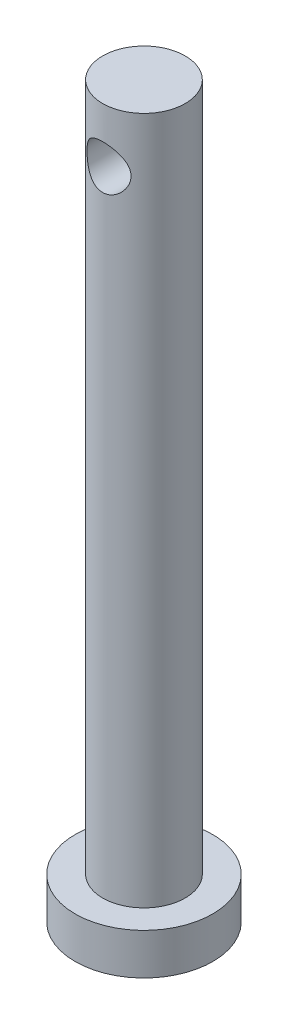
ISO-10303-21;
HEADER;
FILE_DESCRIPTION(('STEP AP214'),'2;1');
FILE_NAME('part.step','',(''),(''),'','','');
FILE_SCHEMA(('AUTOMOTIVE_DESIGN { 1 0 10303 214 1 1 1 1 }'));
ENDSEC;
DATA;
#1=APPLICATION_CONTEXT('core data for automotive mechanical design processes');
#2=APPLICATION_PROTOCOL_DEFINITION('international standard','automotive_design',2000,#1);
#3=PRODUCT_CONTEXT('',#1,'mechanical');
#4=PRODUCT('Part','Part','',(#3));
#5=PRODUCT_RELATED_PRODUCT_CATEGORY('part','',(#4));
#6=PRODUCT_DEFINITION_FORMATION('','',#4);
#7=PRODUCT_DEFINITION_CONTEXT('part definition',#1,'design');
#8=PRODUCT_DEFINITION('design','',#6,#7);
#9=PRODUCT_DEFINITION_SHAPE('','',#8);
#10=(LENGTH_UNIT() NAMED_UNIT(*) SI_UNIT(.MILLI.,.METRE.));
#11=(NAMED_UNIT(*) PLANE_ANGLE_UNIT() SI_UNIT($,.RADIAN.));
#12=(NAMED_UNIT(*) SI_UNIT($,.STERADIAN.) SOLID_ANGLE_UNIT());
#13=UNCERTAINTY_MEASURE_WITH_UNIT(LENGTH_MEASURE(1.E-05),#10,'distance_accuracy_value','');
#14=(GEOMETRIC_REPRESENTATION_CONTEXT(3) GLOBAL_UNCERTAINTY_ASSIGNED_CONTEXT((#13)) GLOBAL_UNIT_ASSIGNED_CONTEXT((#10,
#11,#12)) REPRESENTATION_CONTEXT('',''));
#15=CARTESIAN_POINT('',(0.,0.,0.));
#16=DIRECTION('',(0.,0.,1.));
#17=DIRECTION('',(1.,0.,0.));
#18=AXIS2_PLACEMENT_3D('',#15,#16,#17);
#19=CARTESIAN_POINT('',(0.,1.5,0.));
#20=DIRECTION('',(0.,-1.,0.));
#21=DIRECTION('',(0.,0.,-1.));
#22=AXIS2_PLACEMENT_3D('',#19,#20,#21);
#23=CYLINDRICAL_SURFACE('',#22,2.5);
#24=CARTESIAN_POINT('',(0.,1.5,0.));
#25=DIRECTION('',(0.,1.,0.));
#26=DIRECTION('',(0.,0.,1.));
#27=AXIS2_PLACEMENT_3D('',#24,#25,#26);
#28=CIRCLE('',#27,2.5);
#29=CARTESIAN_POINT('',(0.,1.5,2.5));
#30=VERTEX_POINT('',#29);
#31=EDGE_CURVE('E50',#30,#30,#28,.T.);
#32=ORIENTED_EDGE('',*,*,#31,.F.);
#33=EDGE_LOOP('',(#32));
#34=FACE_BOUND('',#33,.T.);
#35=CARTESIAN_POINT('',(0.,0.,0.));
#36=DIRECTION('',(0.,1.,0.));
#37=DIRECTION('',(0.,0.,1.));
#38=AXIS2_PLACEMENT_3D('',#35,#36,#37);
#39=CIRCLE('',#38,2.5);
#40=CARTESIAN_POINT('',(0.,0.,2.5));
#41=VERTEX_POINT('',#40);
#42=EDGE_CURVE('E56',#41,#41,#39,.T.);
#43=ORIENTED_EDGE('',*,*,#42,.T.);
#44=EDGE_LOOP('',(#43));
#45=FACE_BOUND('',#44,.T.);
#46=ADVANCED_FACE('F37',(#34,#45),#23,.T.);
#47=CARTESIAN_POINT('',(0.,1.5,0.));
#48=DIRECTION('',(0.,1.,0.));
#49=DIRECTION('',(0.,0.,1.));
#50=AXIS2_PLACEMENT_3D('',#47,#48,#49);
#51=PLANE('',#50);
#52=CARTESIAN_POINT('',(0.,1.5,0.));
#53=DIRECTION('',(0.,1.,0.));
#54=DIRECTION('',(0.,0.,1.));
#55=AXIS2_PLACEMENT_3D('',#52,#53,#54);
#56=CIRCLE('',#55,1.5);
#57=CARTESIAN_POINT('',(0.,1.5,1.5));
#58=VERTEX_POINT('',#57);
#59=EDGE_CURVE('E10',#58,#58,#56,.T.);
#60=ORIENTED_EDGE('',*,*,#59,.F.);
#61=EDGE_LOOP('',(#60));
#62=FACE_BOUND('',#61,.T.);
#63=ORIENTED_EDGE('',*,*,#31,.T.);
#64=EDGE_LOOP('',(#63));
#65=FACE_BOUND('',#64,.T.);
#66=ADVANCED_FACE('F88',(#62,#65),#51,.T.);
#67=CARTESIAN_POINT('',(0.,0.,0.));
#68=DIRECTION('',(0.,1.,0.));
#69=DIRECTION('',(0.,0.,1.));
#70=AXIS2_PLACEMENT_3D('',#67,#68,#69);
#71=PLANE('',#70);
#72=ORIENTED_EDGE('',*,*,#42,.F.);
#73=EDGE_LOOP('',(#72));
#74=FACE_BOUND('',#73,.T.);
#75=ADVANCED_FACE('F84',(#74),#71,.F.);
#76=CARTESIAN_POINT('',(0.,26.5,0.));
#77=DIRECTION('',(0.,-1.,0.));
#78=DIRECTION('',(0.,0.,-1.));
#79=AXIS2_PLACEMENT_3D('',#76,#77,#78);
#80=CYLINDRICAL_SURFACE('',#79,1.5);
#81=CARTESIAN_POINT('',(0.,25.3,-1.5));
#82=CARTESIAN_POINT('',(-0.0417140042937088,25.2999972917102,-1.49999758414449));
#83=CARTESIAN_POINT('',(-0.0834672912539164,25.2967184035876,-1.49824189360224));
#84=CARTESIAN_POINT('',(-0.165718197334508,25.283758299134,-1.49139129667971));
#85=CARTESIAN_POINT('',(-0.206213769841148,25.2740671669965,-1.48629121869364));
#86=CARTESIAN_POINT('',(-0.284638594945811,25.2487801601417,-1.47328036800654));
#87=CARTESIAN_POINT('',(-0.322577512237572,25.2332081858101,-1.46538097991501));
#88=CARTESIAN_POINT('',(-0.395235474229212,25.196737448288,-1.4474774987237));
#89=CARTESIAN_POINT('',(-0.429954504316263,25.1758386609244,-1.43747339607276));
#90=CARTESIAN_POINT('',(-0.497767319459639,25.1277484382682,-1.41547900666031));
#91=CARTESIAN_POINT('',(-0.530602027463185,25.1002323964802,-1.4034011481073));
#92=CARTESIAN_POINT('',(-0.591434030661653,25.0403968543132,-1.37887042167267));
#93=CARTESIAN_POINT('',(-0.619427089896366,25.0080731932663,-1.36641723648963));
#94=CARTESIAN_POINT('',(-0.672354419511099,24.9360219415222,-1.34122140682262));
#95=CARTESIAN_POINT('',(-0.696776837026744,24.895887951337,-1.32855595701366));
#96=CARTESIAN_POINT('',(-0.738426416316995,24.8113543186488,-1.30586838669548));
#97=CARTESIAN_POINT('',(-0.75565913819353,24.7669580051932,-1.29584422578236));
#98=CARTESIAN_POINT('',(-0.781243551670881,24.6779457306387,-1.28057394848523));
#99=CARTESIAN_POINT('',(-0.79008311742479,24.6335170279096,-1.27506829565278));
#100=CARTESIAN_POINT('',(-0.800094972405448,24.5434961280342,-1.26881331156942));
#101=CARTESIAN_POINT('',(-0.801276946959553,24.4979054738658,-1.26805797215382));
#102=CARTESIAN_POINT('',(-0.796296021649252,24.4137781343534,-1.27118648805135));
#103=CARTESIAN_POINT('',(-0.791143222976705,24.3751515533778,-1.27443251356391));
#104=CARTESIAN_POINT('',(-0.775413455073683,24.299425376058,-1.28406317281932));
#105=CARTESIAN_POINT('',(-0.764834303757536,24.2623264004943,-1.29044906914779));
#106=CARTESIAN_POINT('',(-0.738390252390663,24.1896619734264,-1.30576277857079));
#107=CARTESIAN_POINT('',(-0.722411944930874,24.154149696915,-1.31474447400447));
#108=CARTESIAN_POINT('',(-0.685716522966987,24.0861304736426,-1.3342504708289));
#109=CARTESIAN_POINT('',(-0.66499730854369,24.053624867631,-1.34477545505385));
#110=CARTESIAN_POINT('',(-0.615868522436842,23.9875141387867,-1.36804524940245));
#111=CARTESIAN_POINT('',(-0.58677629115989,23.9544492647533,-1.38088899493241));
#112=CARTESIAN_POINT('',(-0.523451373374351,23.8934246423101,-1.40611558623123));
#113=CARTESIAN_POINT('',(-0.489215573049462,23.8654680092069,-1.41849814710228));
#114=CARTESIAN_POINT('',(-0.414022077031181,23.8138622850858,-1.44230010999534));
#115=CARTESIAN_POINT('',(-0.372785484410792,23.7905688918061,-1.45361823088172));
#116=CARTESIAN_POINT('',(-0.286226859736146,23.7514521168231,-1.47310395304255));
#117=CARTESIAN_POINT('',(-0.240908517249559,23.7356220679969,-1.48127436501701));
#118=CARTESIAN_POINT('',(-0.151832213955906,23.7133223875927,-1.4929099561423));
#119=CARTESIAN_POINT('',(-0.108300131382032,23.70613929869,-1.49673204992477));
#120=CARTESIAN_POINT('',(-0.0204895975412045,23.6990524967996,-1.50050221027202));
#121=CARTESIAN_POINT('',(0.0237884072843994,23.6991445741977,-1.50045251716091));
#122=CARTESIAN_POINT('',(0.107545959760606,23.7062499288307,-1.49667382258832));
#123=CARTESIAN_POINT('',(0.14709644926773,23.7126346407483,-1.49327897244287));
#124=CARTESIAN_POINT('',(0.224469554831581,23.7311074420979,-1.48362188327846));
#125=CARTESIAN_POINT('',(0.262291990687246,23.7431961248567,-1.47735934596487));
#126=CARTESIAN_POINT('',(0.336250167522202,23.7729749424682,-1.46232570811689));
#127=CARTESIAN_POINT('',(0.372320333376869,23.7907972349183,-1.4534959496239));
#128=CARTESIAN_POINT('',(0.441062157410961,23.8313751543016,-1.43413438081761));
#129=CARTESIAN_POINT('',(0.473732482002724,23.8541327063769,-1.42360190671964));
#130=CARTESIAN_POINT('',(0.538489644606411,23.9067448011077,-1.40047645695353));
#131=CARTESIAN_POINT('',(0.570134865108252,23.9370996673289,-1.38778372966929));
#132=CARTESIAN_POINT('',(0.628109862741503,24.0026128359152,-1.36252708549313));
#133=CARTESIAN_POINT('',(0.654434715474712,24.037775538292,-1.34996329805962));
#134=CARTESIAN_POINT('',(0.70274076630891,24.114826486175,-1.32549514327965));
#135=CARTESIAN_POINT('',(0.724310244689174,24.1570081387794,-1.31369210729127));
#136=CARTESIAN_POINT('',(0.759824848176571,24.2452100900862,-1.29347935062968));
#137=CARTESIAN_POINT('',(0.77378083036948,24.2912248141217,-1.28506480237658));
#138=CARTESIAN_POINT('',(0.792295451806951,24.3810138470975,-1.27372513461019));
#139=CARTESIAN_POINT('',(0.797640611545243,24.4245661837155,-1.27034308682665));
#140=CARTESIAN_POINT('',(0.801103834511683,24.5120603141804,-1.26816359887642));
#141=CARTESIAN_POINT('',(0.799226824740038,24.5560018221226,-1.26936303319563));
#142=CARTESIAN_POINT('',(0.789056350744178,24.6373463548581,-1.27570247677833));
#143=CARTESIAN_POINT('',(0.781570591370403,24.6748948907275,-1.28034575552508));
#144=CARTESIAN_POINT('',(0.761493436479322,24.7481339575411,-1.29238691721072));
#145=CARTESIAN_POINT('',(0.748900147495982,24.7838237938842,-1.29978582163339));
#146=CARTESIAN_POINT('',(0.718080352112418,24.8549047795466,-1.3170766557443));
#147=CARTESIAN_POINT('',(0.699543207429632,24.8901285674158,-1.32709848411839));
#148=CARTESIAN_POINT('',(0.657671226676285,24.9572019357598,-1.34833960706443));
#149=CARTESIAN_POINT('',(0.634333807313365,24.9890496853594,-1.35955954483521));
#150=CARTESIAN_POINT('',(0.579583602633468,25.0532730938803,-1.38387269806828));
#151=CARTESIAN_POINT('',(0.54749101835218,25.0850587404488,-1.39700212075101));
#152=CARTESIAN_POINT('',(0.478150164559821,25.1429722703881,-1.42222830059072));
#153=CARTESIAN_POINT('',(0.440898582826826,25.1690964911038,-1.43432438618419));
#154=CARTESIAN_POINT('',(0.3610220026222,25.2154339599367,-1.45651015109521));
#155=CARTESIAN_POINT('',(0.318288665753909,25.2354886264249,-1.4665441059256));
#156=CARTESIAN_POINT('',(0.229399331630398,25.2678536227339,-1.48303856571174));
#157=CARTESIAN_POINT('',(0.183252846928634,25.2801846321223,-1.48950860714735));
#158=CARTESIAN_POINT('',(0.113807677907483,25.2921926712721,-1.49584776109147));
#159=CARTESIAN_POINT('',(0.0911777471195392,25.2951148842016,-1.49739944315896));
#160=CARTESIAN_POINT('',(0.0457024774465213,25.2990193021585,-1.49947623062919));
#161=CARTESIAN_POINT('',(0.0228571359907306,25.300001484004,-1.50000132376498));
#162=CARTESIAN_POINT('',(0.,25.3,-1.5));
#163=B_SPLINE_CURVE_WITH_KNOTS('',3,(#81,#82,#83,#84,#85,#86,#87,#88,#89,#90,#91,#92,#93,#94,
#95,#96,#97,#98,#99,#100,#101,#102,#103,#104,#105,#106,#107,#108,#109,#110,#111,#112,#113,#114,
#115,#116,#117,#118,#119,#120,#121,#122,#123,#124,#125,#126,#127,#128,#129,#130,#131,#132,#133,
#134,#135,#136,#137,#138,#139,#140,#141,#142,#143,#144,#145,#146,#147,#148,#149,#150,#151,#152,
#153,#154,#155,#156,#157,#158,#159,#160,#161,#162),.UNSPECIFIED.,.T.,.F.,(4,2,2,2,2,2,2,2,2,2,2,
2,2,2,2,2,2,2,2,2,2,2,2,2,2,2,2,2,2,2,2,2,2,2,2,2,2,2,2,2,4),(0.,0.125049785968991,
0.250293400579707,0.375033395431379,0.49977395636337,0.632758937517728,0.765859685119312,
0.911100210896853,1.0562282067719,1.19228300426694,1.32816568589671,1.44492819552126,
1.56173769541659,1.68117137196064,1.80065805275817,1.93770170276478,2.07482865313357,
2.22012229846781,2.36528590361979,2.49740165319181,2.62944095746674,2.74950324975935,
2.86957803367866,2.99264692026345,3.11576390008819,3.2521377258514,3.38863720347795,
3.53432584534743,3.67980618389778,3.81103787448892,3.94218005404204,4.05738088818269,
4.17262446873053,4.29529226385601,4.41802624681407,4.55851375899381,4.69909188991154,
4.84307664846753,4.98667423094966,5.05519428454421,5.12371515689633),.UNSPECIFIED.);
#164=CARTESIAN_POINT('',(0.,25.3,-1.5));
#165=VERTEX_POINT('',#164);
#166=EDGE_CURVE('E40',#165,#165,#163,.T.);
#167=ORIENTED_EDGE('',*,*,#166,.T.);
#168=EDGE_LOOP('',(#167));
#169=FACE_BOUND('',#168,.T.);
#170=CARTESIAN_POINT('',(0.799999999999999,24.5,1.26885775404495));
#171=CARTESIAN_POINT('',(0.799996864513051,24.458762734481,1.26886196661874));
#172=CARTESIAN_POINT('',(0.796789664925113,24.4174837174134,1.27089944626369));
#173=CARTESIAN_POINT('',(0.784141291009917,24.3362291826284,1.27873921411509));
#174=CARTESIAN_POINT('',(0.774688773493129,24.2962561758769,1.28454835234238));
#175=CARTESIAN_POINT('',(0.750097396273409,24.2189478007503,1.29905904209522));
#176=CARTESIAN_POINT('',(0.73499213411089,24.181598366817,1.30774346962923));
#177=CARTESIAN_POINT('',(0.699627256753739,24.1099757695486,1.32699887256592));
#178=CARTESIAN_POINT('',(0.679366805899382,24.0757031061798,1.3375701537459));
#179=CARTESIAN_POINT('',(0.632023751834454,24.0076351290107,1.36062558490874));
#180=CARTESIAN_POINT('',(0.604477080012548,23.974191700367,1.37319608798891));
#181=CARTESIAN_POINT('',(0.544304228810776,23.9121200552841,1.39813960186555));
#182=CARTESIAN_POINT('',(0.511675214724456,23.8834945447182,1.41051249817365));
#183=CARTESIAN_POINT('',(0.439108047858338,23.8296399614189,1.43483798338867));
#184=CARTESIAN_POINT('',(0.39879540786664,23.804860459726,1.44667936834789));
#185=CARTESIAN_POINT('',(0.313822774935419,23.7625979764783,1.4674543508573));
#186=CARTESIAN_POINT('',(0.269165926407689,23.7451097651204,1.47639003155785));
#187=CARTESIAN_POINT('',(0.180514514600768,23.7193766465765,1.48971871408987));
#188=CARTESIAN_POINT('',(0.136747205617521,23.7105097801994,1.49441524613384));
#189=CARTESIAN_POINT('',(0.0481154730549656,23.7002055395077,1.49988363624653));
#190=CARTESIAN_POINT('',(0.00325184397866042,23.6987629363926,1.50065825645443));
#191=CARTESIAN_POINT('',(-0.08154999995219,23.7031481461081,1.49832286926248));
#192=CARTESIAN_POINT('',(-0.121537611195848,23.7082729658366,1.49558843812923));
#193=CARTESIAN_POINT('',(-0.199984967913362,23.7243651642756,1.48713233848782));
#194=CARTESIAN_POINT('',(-0.238444597045448,23.7353329869644,1.48141044297904));
#195=CARTESIAN_POINT('',(-0.313348321881749,23.7628265320405,1.46740708636072));
#196=CARTESIAN_POINT('',(-0.349762714854435,23.779417330473,1.45909575243493));
#197=CARTESIAN_POINT('',(-0.419368306071066,23.8175725221139,1.44063483401394));
#198=CARTESIAN_POINT('',(-0.452558417442181,23.8391385842232,1.43048463293558));
#199=CARTESIAN_POINT('',(-0.518447006228243,23.8891833549813,1.40802908686016));
#200=CARTESIAN_POINT('',(-0.550738571603075,23.9181466633751,1.39560941242777));
#201=CARTESIAN_POINT('',(-0.610240413321964,23.9808865794078,1.37063855232127));
#202=CARTESIAN_POINT('',(-0.637445856922971,24.0146677116816,1.35808725341625));
#203=CARTESIAN_POINT('',(-0.688142739262383,24.089326392009,1.33316143624031));
#204=CARTESIAN_POINT('',(-0.711168968556944,24.1305541684691,1.32087975949967));
#205=CARTESIAN_POINT('',(-0.749795437753226,24.2170785911098,1.29934599305322));
#206=CARTESIAN_POINT('',(-0.765404099589988,24.262370552972,1.2900904711841));
#207=CARTESIAN_POINT('',(-0.787414593051423,24.3519228639462,1.27676652055075));
#208=CARTESIAN_POINT('',(-0.794460652312182,24.395968778508,1.27233817524479));
#209=CARTESIAN_POINT('',(-0.801092295961593,24.4848221695914,1.26817570645216));
#210=CARTESIAN_POINT('',(-0.800685114570186,24.5296288654787,1.26843703110121));
#211=CARTESIAN_POINT('',(-0.793012576559899,24.6123609659239,1.27324146590537));
#212=CARTESIAN_POINT('',(-0.786663890603776,24.6504109201346,1.27721214325595));
#213=CARTESIAN_POINT('',(-0.76871656790485,24.7248111870943,1.28809322443619));
#214=CARTESIAN_POINT('',(-0.757115872866362,24.7611608273113,1.29500478075103));
#215=CARTESIAN_POINT('',(-0.728478896070427,24.8329865456766,1.31133528432453));
#216=CARTESIAN_POINT('',(-0.71122465174705,24.8683526520711,1.32085171604477));
#217=CARTESIAN_POINT('',(-0.671952934296525,24.9358984076819,1.34125642703201));
#218=CARTESIAN_POINT('',(-0.649933037877969,24.9680764236029,1.35214540304482));
#219=CARTESIAN_POINT('',(-0.597980606850555,25.0332946654189,1.37599067873094));
#220=CARTESIAN_POINT('',(-0.567360485146421,25.0657647590195,1.38901537145198));
#221=CARTESIAN_POINT('',(-0.500966861660939,25.1253173878375,1.41431776647649));
#222=CARTESIAN_POINT('',(-0.465190817525478,25.1523972493855,1.4265950959865));
#223=CARTESIAN_POINT('',(-0.387557548308534,25.201420887761,1.44965641221178));
#224=CARTESIAN_POINT('',(-0.345509385844549,25.2231044425832,1.46035713214022));
#225=CARTESIAN_POINT('',(-0.257628537747278,25.2588620401344,1.47838829057854));
#226=CARTESIAN_POINT('',(-0.211799647624748,25.2729436099377,1.48572206177843));
#227=CARTESIAN_POINT('',(-0.122542623944414,25.2917408730137,1.4955925218321));
#228=CARTESIAN_POINT('',(-0.0793251002202951,25.2972449020086,1.49853179980277));
#229=CARTESIAN_POINT('',(0.00751346654484652,25.3011427516989,1.50060859243269));
#230=CARTESIAN_POINT('',(0.0511343147932538,25.2995398423889,1.49974785552879));
#231=CARTESIAN_POINT('',(0.13378899457934,25.2897415347638,1.49454920950015));
#232=CARTESIAN_POINT('',(0.172907860140316,25.2820915214264,1.49049906133755));
#233=CARTESIAN_POINT('',(0.249221877864193,25.2612187145492,1.47965354156648));
#234=CARTESIAN_POINT('',(0.286416785810592,25.2479952154813,1.47285782241034));
#235=CARTESIAN_POINT('',(0.359425889447871,25.2158659413127,1.45679902343013));
#236=CARTESIAN_POINT('',(0.395135125917096,25.1967646922467,1.44745256335822));
#237=CARTESIAN_POINT('',(0.462971321864471,25.1536623978907,1.4272045164322));
#238=CARTESIAN_POINT('',(0.495096728131303,25.1296592408005,1.41630225993429));
#239=CARTESIAN_POINT('',(0.558607472252001,25.0743868017919,1.39256226025897));
#240=CARTESIAN_POINT('',(0.58952007263063,25.0426080235873,1.37964368678354));
#241=CARTESIAN_POINT('',(0.64578994397725,24.9742543886591,1.3542197273833));
#242=CARTESIAN_POINT('',(0.671141079191596,24.9376743052182,1.34171481061365));
#243=CARTESIAN_POINT('',(0.716834489773424,24.8582714452726,1.31789525425207));
#244=CARTESIAN_POINT('',(0.7368328500416,24.8152183752009,1.30668119417458));
#245=CARTESIAN_POINT('',(0.768999694768329,24.7255851394643,1.28801884527121));
#246=CARTESIAN_POINT('',(0.781193789013039,24.6790170766059,1.2805582568072));
#247=CARTESIAN_POINT('',(0.792724634734877,24.6098759937845,1.27342167136347));
#248=CARTESIAN_POINT('',(0.79544712893046,24.5880295511891,1.27171869731203));
#249=CARTESIAN_POINT('',(0.799085684611174,24.5441260636661,1.2694355902716));
#250=CARTESIAN_POINT('',(0.800001678023373,24.5220690108339,1.26885549959536));
#251=CARTESIAN_POINT('',(0.799999999999999,24.5,1.26885775404495));
#252=B_SPLINE_CURVE_WITH_KNOTS('',3,(#170,#171,#172,#173,#174,#175,#176,#177,#178,#179,#180,
#181,#182,#183,#184,#185,#186,#187,#188,#189,#190,#191,#192,#193,#194,#195,#196,#197,#198,#199,
#200,#201,#202,#203,#204,#205,#206,#207,#208,#209,#210,#211,#212,#213,#214,#215,#216,#217,#218,
#219,#220,#221,#222,#223,#224,#225,#226,#227,#228,#229,#230,#231,#232,#233,#234,#235,#236,#237,
#238,#239,#240,#241,#242,#243,#244,#245,#246,#247,#248,#249,#250,#251),.UNSPECIFIED.,.T.,.F.,(4,
2,2,2,2,2,2,2,2,2,2,2,2,2,2,2,2,2,2,2,2,2,2,2,2,2,2,2,2,2,2,2,2,2,2,2,2,2,2,2,4),(0.,
0.123618473587386,0.247462091316306,0.370581032680865,0.493719944441366,0.628508086262538,
0.76337167796265,0.908933729355953,1.05439119350289,1.1883377108482,1.32218987868885,
1.44284125255474,1.56350179537475,1.68560936718268,1.80775795842542,1.94255700923055,
2.07748349986593,2.22310306735306,2.36855690043648,2.50220973902213,2.63573285917237,
2.75154856612196,2.86740970132552,2.98840170593532,3.10945537905412,3.24832564333196,
3.38726461948577,3.53197776928604,3.67654736791844,3.80682374917255,3.93704019479741,
4.05669244864875,4.17635985340894,4.3005399092303,4.42477357658542,4.56271446031724,
4.7008067720737,4.84634738140328,4.99140791510707,5.05756251100804,5.12371959971244),.UNSPECIFIED.);
#253=CARTESIAN_POINT('',(0.799999999999999,24.5,1.26885775404495));
#254=VERTEX_POINT('',#253);
#255=EDGE_CURVE('E63',#254,#254,#252,.T.);
#256=ORIENTED_EDGE('',*,*,#255,.T.);
#257=EDGE_LOOP('',(#256));
#258=FACE_BOUND('',#257,.T.);
#259=CARTESIAN_POINT('',(0.,26.5,0.));
#260=DIRECTION('',(0.,1.,0.));
#261=DIRECTION('',(0.,0.,1.));
#262=AXIS2_PLACEMENT_3D('',#259,#260,#261);
#263=CIRCLE('',#262,1.5);
#264=CARTESIAN_POINT('',(0.,26.5,1.5));
#265=VERTEX_POINT('',#264);
#266=EDGE_CURVE('E59',#265,#265,#263,.T.);
#267=ORIENTED_EDGE('',*,*,#266,.F.);
#268=EDGE_LOOP('',(#267));
#269=FACE_BOUND('',#268,.T.);
#270=ORIENTED_EDGE('',*,*,#59,.T.);
#271=EDGE_LOOP('',(#270));
#272=FACE_BOUND('',#271,.T.);
#273=ADVANCED_FACE('F69',(#169,#258,#269,#272),#80,.T.);
#274=CARTESIAN_POINT('',(0.,26.5,0.));
#275=DIRECTION('',(0.,1.,0.));
#276=DIRECTION('',(0.,0.,1.));
#277=AXIS2_PLACEMENT_3D('',#274,#275,#276);
#278=PLANE('',#277);
#279=ORIENTED_EDGE('',*,*,#266,.T.);
#280=EDGE_LOOP('',(#279));
#281=FACE_BOUND('',#280,.T.);
#282=ADVANCED_FACE('F76',(#281),#278,.T.);
#283=CARTESIAN_POINT('',(0.,24.5,-5.));
#284=DIRECTION('',(0.,0.,1.));
#285=DIRECTION('',(1.,0.,0.));
#286=AXIS2_PLACEMENT_3D('',#283,#284,#285);
#287=CYLINDRICAL_SURFACE('',#286,0.799999999999999);
#288=ORIENTED_EDGE('',*,*,#255,.F.);
#289=EDGE_LOOP('',(#288));
#290=FACE_BOUND('',#289,.T.);
#291=ORIENTED_EDGE('',*,*,#166,.F.);
#292=EDGE_LOOP('',(#291));
#293=FACE_BOUND('',#292,.T.);
#294=ADVANCED_FACE('F73',(#290,#293),#287,.F.);
#295=CLOSED_SHELL('',(#46,#66,#75,#273,#282,#294));
#296=MANIFOLD_SOLID_BREP('B2',#295);
#297=ADVANCED_BREP_SHAPE_REPRESENTATION('',(#18,#296),#14);
#298=SHAPE_DEFINITION_REPRESENTATION(#9,#297);
ENDSEC;
END-ISO-10303-21;
